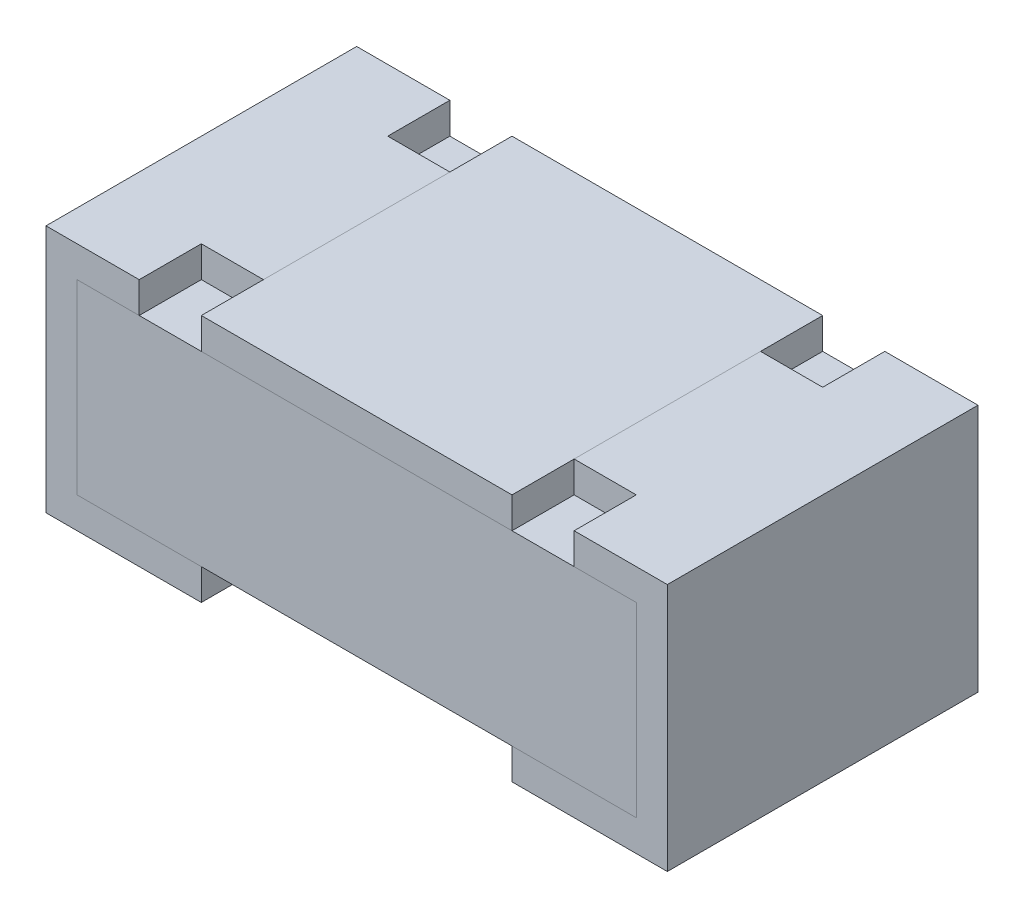
ISO-10303-21;
HEADER;
FILE_DESCRIPTION(('STEP AP214'),'2;1');
FILE_NAME('part.step','',(''),(''),'','','');
FILE_SCHEMA(('AUTOMOTIVE_DESIGN { 1 0 10303 214 1 1 1 1 }'));
ENDSEC;
DATA;
#1=APPLICATION_CONTEXT('core data for automotive mechanical design processes');
#2=APPLICATION_PROTOCOL_DEFINITION('international standard','automotive_design',2000,#1);
#3=PRODUCT_CONTEXT('',#1,'mechanical');
#4=PRODUCT('Part','Part','',(#3));
#5=PRODUCT_RELATED_PRODUCT_CATEGORY('part','',(#4));
#6=PRODUCT_DEFINITION_FORMATION('','',#4);
#7=PRODUCT_DEFINITION_CONTEXT('part definition',#1,'design');
#8=PRODUCT_DEFINITION('design','',#6,#7);
#9=PRODUCT_DEFINITION_SHAPE('','',#8);
#10=(LENGTH_UNIT() NAMED_UNIT(*) SI_UNIT(.MILLI.,.METRE.));
#11=(NAMED_UNIT(*) PLANE_ANGLE_UNIT() SI_UNIT($,.RADIAN.));
#12=(NAMED_UNIT(*) SI_UNIT($,.STERADIAN.) SOLID_ANGLE_UNIT());
#13=UNCERTAINTY_MEASURE_WITH_UNIT(LENGTH_MEASURE(1.E-05),#10,'distance_accuracy_value','');
#14=(GEOMETRIC_REPRESENTATION_CONTEXT(3) GLOBAL_UNCERTAINTY_ASSIGNED_CONTEXT((#13)) GLOBAL_UNIT_ASSIGNED_CONTEXT((#10,
#11,#12)) REPRESENTATION_CONTEXT('',''));
#15=CARTESIAN_POINT('',(0.,0.,0.));
#16=DIRECTION('',(0.,0.,1.));
#17=DIRECTION('',(1.,0.,0.));
#18=AXIS2_PLACEMENT_3D('',#15,#16,#17);
#19=CARTESIAN_POINT('',(-0.45,0.05,-0.25));
#20=DIRECTION('',(0.,1.,0.));
#21=DIRECTION('',(0.,0.,1.));
#22=AXIS2_PLACEMENT_3D('',#19,#20,#21);
#23=PLANE('',#22);
#24=DIRECTION('',(0.,0.,-1.));
#25=VECTOR('',#24,1.);
#26=CARTESIAN_POINT('',(-0.45,0.05,-0.25));
#27=LINE('',#26,#25);
#28=CARTESIAN_POINT('',(-0.45,0.05,0.25));
#29=VERTEX_POINT('',#28);
#30=CARTESIAN_POINT('',(-0.45,0.05,-0.25));
#31=VERTEX_POINT('',#30);
#32=EDGE_CURVE('P0_E58',#29,#31,#27,.T.);
#33=ORIENTED_EDGE('',*,*,#32,.T.);
#34=DIRECTION('',(1.,0.,0.));
#35=VECTOR('',#34,1.);
#36=CARTESIAN_POINT('',(0.45,0.05,-0.25));
#37=LINE('',#36,#35);
#38=CARTESIAN_POINT('',(0.45,0.05,-0.25));
#39=VERTEX_POINT('',#38);
#40=EDGE_CURVE('P0_E20',#31,#39,#37,.T.);
#41=ORIENTED_EDGE('',*,*,#40,.T.);
#42=DIRECTION('',(0.,0.,1.));
#43=VECTOR('',#42,1.);
#44=CARTESIAN_POINT('',(0.45,0.05,-0.25));
#45=LINE('',#44,#43);
#46=CARTESIAN_POINT('',(0.45,0.05,0.25));
#47=VERTEX_POINT('',#46);
#48=EDGE_CURVE('P0_E55',#39,#47,#45,.T.);
#49=ORIENTED_EDGE('',*,*,#48,.T.);
#50=DIRECTION('',(-1.,0.,0.));
#51=VECTOR('',#50,1.);
#52=CARTESIAN_POINT('',(0.45,0.05,0.25));
#53=LINE('',#52,#51);
#54=EDGE_CURVE('P0_E76',#47,#29,#53,.T.);
#55=ORIENTED_EDGE('',*,*,#54,.T.);
#56=EDGE_LOOP('',(#33,#41,#49,#55));
#57=FACE_BOUND('',#56,.T.);
#58=ADVANCED_FACE('P0_F17',(#57),#23,.F.);
#59=CARTESIAN_POINT('',(0.45,0.35,-0.25));
#60=DIRECTION('',(0.,0.,1.));
#61=DIRECTION('',(1.,0.,0.));
#62=AXIS2_PLACEMENT_3D('',#59,#60,#61);
#63=PLANE('',#62);
#64=ORIENTED_EDGE('',*,*,#40,.F.);
#65=DIRECTION('',(0.,1.,0.));
#66=VECTOR('',#65,1.);
#67=CARTESIAN_POINT('',(-0.45,0.35,-0.25));
#68=LINE('',#67,#66);
#69=CARTESIAN_POINT('',(-0.45,0.35,-0.25));
#70=VERTEX_POINT('',#69);
#71=EDGE_CURVE('P0_E80',#31,#70,#68,.T.);
#72=ORIENTED_EDGE('',*,*,#71,.T.);
#73=DIRECTION('',(1.,0.,0.));
#74=VECTOR('',#73,1.);
#75=CARTESIAN_POINT('',(-0.45,0.35,-0.25));
#76=LINE('',#75,#74);
#77=CARTESIAN_POINT('',(0.45,0.35,-0.25));
#78=VERTEX_POINT('',#77);
#79=EDGE_CURVE('P0_E73',#70,#78,#76,.T.);
#80=ORIENTED_EDGE('',*,*,#79,.T.);
#81=DIRECTION('',(0.,1.,0.));
#82=VECTOR('',#81,1.);
#83=CARTESIAN_POINT('',(0.45,0.35,-0.25));
#84=LINE('',#83,#82);
#85=EDGE_CURVE('P0_E63',#78,#39,#84,.F.);
#86=ORIENTED_EDGE('',*,*,#85,.T.);
#87=EDGE_LOOP('',(#64,#72,#80,#86));
#88=FACE_BOUND('',#87,.T.);
#89=ADVANCED_FACE('P0_F72',(#88),#63,.F.);
#90=CARTESIAN_POINT('',(0.45,0.35,-0.25));
#91=DIRECTION('',(-1.,0.,0.));
#92=DIRECTION('',(0.,0.,1.));
#93=AXIS2_PLACEMENT_3D('',#90,#91,#92);
#94=PLANE('',#93);
#95=ORIENTED_EDGE('',*,*,#48,.F.);
#96=ORIENTED_EDGE('',*,*,#85,.F.);
#97=DIRECTION('',(0.,0.,-1.));
#98=VECTOR('',#97,1.);
#99=CARTESIAN_POINT('',(0.45,0.35,0.25));
#100=LINE('',#99,#98);
#101=CARTESIAN_POINT('',(0.45,0.35,0.25));
#102=VERTEX_POINT('',#101);
#103=EDGE_CURVE('P0_E83',#78,#102,#100,.F.);
#104=ORIENTED_EDGE('',*,*,#103,.T.);
#105=DIRECTION('',(0.,1.,0.));
#106=VECTOR('',#105,1.);
#107=CARTESIAN_POINT('',(0.45,0.35,0.25));
#108=LINE('',#107,#106);
#109=EDGE_CURVE('P0_E69',#102,#47,#108,.F.);
#110=ORIENTED_EDGE('',*,*,#109,.T.);
#111=EDGE_LOOP('',(#95,#96,#104,#110));
#112=FACE_BOUND('',#111,.T.);
#113=ADVANCED_FACE('P0_F66',(#112),#94,.F.);
#114=CARTESIAN_POINT('',(0.45,0.35,0.25));
#115=DIRECTION('',(0.,0.,-1.));
#116=DIRECTION('',(-1.,0.,0.));
#117=AXIS2_PLACEMENT_3D('',#114,#115,#116);
#118=PLANE('',#117);
#119=ORIENTED_EDGE('',*,*,#54,.F.);
#120=ORIENTED_EDGE('',*,*,#109,.F.);
#121=DIRECTION('',(1.,0.,0.));
#122=VECTOR('',#121,1.);
#123=CARTESIAN_POINT('',(-0.45,0.35,0.25));
#124=LINE('',#123,#122);
#125=CARTESIAN_POINT('',(-0.45,0.35,0.25));
#126=VERTEX_POINT('',#125);
#127=EDGE_CURVE('P0_E26',#102,#126,#124,.F.);
#128=ORIENTED_EDGE('',*,*,#127,.T.);
#129=DIRECTION('',(0.,1.,0.));
#130=VECTOR('',#129,1.);
#131=CARTESIAN_POINT('',(-0.45,0.35,0.25));
#132=LINE('',#131,#130);
#133=EDGE_CURVE('P0_E34',#126,#29,#132,.F.);
#134=ORIENTED_EDGE('',*,*,#133,.T.);
#135=EDGE_LOOP('',(#119,#120,#128,#134));
#136=FACE_BOUND('',#135,.T.);
#137=ADVANCED_FACE('P0_F88',(#136),#118,.F.);
#138=CARTESIAN_POINT('',(-0.45,0.35,-0.25));
#139=DIRECTION('',(1.,0.,0.));
#140=DIRECTION('',(0.,0.,-1.));
#141=AXIS2_PLACEMENT_3D('',#138,#139,#140);
#142=PLANE('',#141);
#143=ORIENTED_EDGE('',*,*,#32,.F.);
#144=ORIENTED_EDGE('',*,*,#133,.F.);
#145=DIRECTION('',(0.,0.,-1.));
#146=VECTOR('',#145,1.);
#147=CARTESIAN_POINT('',(-0.45,0.35,0.25));
#148=LINE('',#147,#146);
#149=EDGE_CURVE('P0_E11',#126,#70,#148,.T.);
#150=ORIENTED_EDGE('',*,*,#149,.T.);
#151=ORIENTED_EDGE('',*,*,#71,.F.);
#152=EDGE_LOOP('',(#143,#144,#150,#151));
#153=FACE_BOUND('',#152,.T.);
#154=ADVANCED_FACE('P0_F91',(#153),#142,.F.);
#155=CARTESIAN_POINT('',(-0.45,0.35,0.25));
#156=DIRECTION('',(0.,-1.,0.));
#157=DIRECTION('',(0.,0.,-1.));
#158=AXIS2_PLACEMENT_3D('',#155,#156,#157);
#159=PLANE('',#158);
#160=ORIENTED_EDGE('',*,*,#127,.F.);
#161=ORIENTED_EDGE('',*,*,#103,.F.);
#162=ORIENTED_EDGE('',*,*,#79,.F.);
#163=ORIENTED_EDGE('',*,*,#149,.F.);
#164=EDGE_LOOP('',(#160,#161,#162,#163));
#165=FACE_BOUND('',#164,.T.);
#166=ADVANCED_FACE('P0_F90',(#165),#159,.F.);
#167=CLOSED_SHELL('',(#58,#89,#113,#137,#154,#166));
#168=MANIFOLD_SOLID_BREP('P0_B1',#167);
#169=CARTESIAN_POINT('',(0.752493781056,0.4,0.25));
#170=DIRECTION('',(0.,-1.,0.));
#171=DIRECTION('',(1.,0.,0.));
#172=AXIS2_PLACEMENT_3D('',#169,#170,#171);
#173=PLANE('',#172);
#174=DIRECTION('',(1.,0.,0.));
#175=VECTOR('',#174,1.);
#176=CARTESIAN_POINT('',(0.752493781056,0.4,-0.25));
#177=LINE('',#176,#175);
#178=CARTESIAN_POINT('',(0.25,0.4,-0.25));
#179=VERTEX_POINT('',#178);
#180=CARTESIAN_POINT('',(-0.25,0.4,-0.25));
#181=VERTEX_POINT('',#180);
#182=EDGE_CURVE('P1_E20',#179,#181,#177,.F.);
#183=ORIENTED_EDGE('',*,*,#182,.T.);
#184=DIRECTION('',(0.,0.,-1.));
#185=VECTOR('',#184,1.);
#186=CARTESIAN_POINT('',(-0.25,0.4,0.25));
#187=LINE('',#186,#185);
#188=CARTESIAN_POINT('',(-0.25,0.4,0.25));
#189=VERTEX_POINT('',#188);
#190=EDGE_CURVE('P1_E55',#181,#189,#187,.F.);
#191=ORIENTED_EDGE('',*,*,#190,.T.);
#192=DIRECTION('',(-1.,0.,0.));
#193=VECTOR('',#192,1.);
#194=CARTESIAN_POINT('',(0.752493781056,0.4,0.25));
#195=LINE('',#194,#193);
#196=CARTESIAN_POINT('',(0.25,0.4,0.25));
#197=VERTEX_POINT('',#196);
#198=EDGE_CURVE('P1_E76',#189,#197,#195,.F.);
#199=ORIENTED_EDGE('',*,*,#198,.T.);
#200=DIRECTION('',(0.,0.,1.));
#201=VECTOR('',#200,1.);
#202=CARTESIAN_POINT('',(0.25,0.4,0.25));
#203=LINE('',#202,#201);
#204=EDGE_CURVE('P1_E58',#179,#197,#203,.T.);
#205=ORIENTED_EDGE('',*,*,#204,.F.);
#206=EDGE_LOOP('',(#183,#191,#199,#205));
#207=FACE_BOUND('',#206,.T.);
#208=ADVANCED_FACE('P1_F17',(#207),#173,.F.);
#209=CARTESIAN_POINT('',(0.752493781056,0.4,-0.25));
#210=DIRECTION('',(0.,0.,1.));
#211=DIRECTION('',(1.,0.,0.));
#212=AXIS2_PLACEMENT_3D('',#209,#210,#211);
#213=PLANE('',#212);
#214=DIRECTION('',(-1.,0.,0.));
#215=VECTOR('',#214,1.);
#216=CARTESIAN_POINT('',(0.752493781056,0.35,-0.25));
#217=LINE('',#216,#215);
#218=CARTESIAN_POINT('',(0.25,0.35,-0.25));
#219=VERTEX_POINT('',#218);
#220=CARTESIAN_POINT('',(-0.25,0.35,-0.25));
#221=VERTEX_POINT('',#220);
#222=EDGE_CURVE('P1_E73',#219,#221,#217,.T.);
#223=ORIENTED_EDGE('',*,*,#222,.T.);
#224=DIRECTION('',(0.,1.,0.));
#225=VECTOR('',#224,1.);
#226=CARTESIAN_POINT('',(-0.25,0.35,-0.25));
#227=LINE('',#226,#225);
#228=EDGE_CURVE('P1_E63',#221,#181,#227,.T.);
#229=ORIENTED_EDGE('',*,*,#228,.T.);
#230=ORIENTED_EDGE('',*,*,#182,.F.);
#231=DIRECTION('',(0.,1.,0.));
#232=VECTOR('',#231,1.);
#233=CARTESIAN_POINT('',(0.25,0.4,-0.25));
#234=LINE('',#233,#232);
#235=EDGE_CURVE('P1_E80',#219,#179,#234,.T.);
#236=ORIENTED_EDGE('',*,*,#235,.F.);
#237=EDGE_LOOP('',(#223,#229,#230,#236));
#238=FACE_BOUND('',#237,.T.);
#239=ADVANCED_FACE('P1_F72',(#238),#213,.F.);
#240=CARTESIAN_POINT('',(-0.25,0.35,0.25));
#241=DIRECTION('',(1.,0.,0.));
#242=DIRECTION('',(0.,0.,-1.));
#243=AXIS2_PLACEMENT_3D('',#240,#241,#242);
#244=PLANE('',#243);
#245=ORIENTED_EDGE('',*,*,#190,.F.);
#246=ORIENTED_EDGE('',*,*,#228,.F.);
#247=DIRECTION('',(0.,0.,1.));
#248=VECTOR('',#247,1.);
#249=CARTESIAN_POINT('',(-0.25,0.35,0.25));
#250=LINE('',#249,#248);
#251=CARTESIAN_POINT('',(-0.25,0.35,0.25));
#252=VERTEX_POINT('',#251);
#253=EDGE_CURVE('P1_E83',#221,#252,#250,.T.);
#254=ORIENTED_EDGE('',*,*,#253,.T.);
#255=DIRECTION('',(0.,1.,0.));
#256=VECTOR('',#255,1.);
#257=CARTESIAN_POINT('',(-0.25,0.4,0.25));
#258=LINE('',#257,#256);
#259=EDGE_CURVE('P1_E69',#252,#189,#258,.T.);
#260=ORIENTED_EDGE('',*,*,#259,.T.);
#261=EDGE_LOOP('',(#245,#246,#254,#260));
#262=FACE_BOUND('',#261,.T.);
#263=ADVANCED_FACE('P1_F66',(#262),#244,.F.);
#264=CARTESIAN_POINT('',(0.752493781056,0.4,0.25));
#265=DIRECTION('',(0.,0.,-1.));
#266=DIRECTION('',(-1.,0.,0.));
#267=AXIS2_PLACEMENT_3D('',#264,#265,#266);
#268=PLANE('',#267);
#269=ORIENTED_EDGE('',*,*,#198,.F.);
#270=ORIENTED_EDGE('',*,*,#259,.F.);
#271=DIRECTION('',(-1.,0.,0.));
#272=VECTOR('',#271,1.);
#273=CARTESIAN_POINT('',(0.752493781056,0.35,0.25));
#274=LINE('',#273,#272);
#275=CARTESIAN_POINT('',(0.25,0.35,0.25));
#276=VERTEX_POINT('',#275);
#277=EDGE_CURVE('P1_E26',#252,#276,#274,.F.);
#278=ORIENTED_EDGE('',*,*,#277,.T.);
#279=DIRECTION('',(0.,1.,0.));
#280=VECTOR('',#279,1.);
#281=CARTESIAN_POINT('',(0.25,0.4,0.25));
#282=LINE('',#281,#280);
#283=EDGE_CURVE('P1_E34',#197,#276,#282,.F.);
#284=ORIENTED_EDGE('',*,*,#283,.F.);
#285=EDGE_LOOP('',(#269,#270,#278,#284));
#286=FACE_BOUND('',#285,.T.);
#287=ADVANCED_FACE('P1_F88',(#286),#268,.F.);
#288=CARTESIAN_POINT('',(0.25,0.4,0.25));
#289=DIRECTION('',(1.,0.,0.));
#290=DIRECTION('',(0.,1.,0.));
#291=AXIS2_PLACEMENT_3D('',#288,#289,#290);
#292=PLANE('',#291);
#293=DIRECTION('',(0.,0.,1.));
#294=VECTOR('',#293,1.);
#295=CARTESIAN_POINT('',(0.25,0.35,0.25));
#296=LINE('',#295,#294);
#297=EDGE_CURVE('P1_E11',#276,#219,#296,.F.);
#298=ORIENTED_EDGE('',*,*,#297,.T.);
#299=ORIENTED_EDGE('',*,*,#235,.T.);
#300=ORIENTED_EDGE('',*,*,#204,.T.);
#301=ORIENTED_EDGE('',*,*,#283,.T.);
#302=EDGE_LOOP('',(#298,#299,#300,#301));
#303=FACE_BOUND('',#302,.T.);
#304=ADVANCED_FACE('P1_F91',(#303),#292,.T.);
#305=CARTESIAN_POINT('',(0.752493781056,0.35,0.25));
#306=DIRECTION('',(0.,1.,0.));
#307=DIRECTION('',(-1.,0.,0.));
#308=AXIS2_PLACEMENT_3D('',#305,#306,#307);
#309=PLANE('',#308);
#310=ORIENTED_EDGE('',*,*,#277,.F.);
#311=ORIENTED_EDGE('',*,*,#253,.F.);
#312=ORIENTED_EDGE('',*,*,#222,.F.);
#313=ORIENTED_EDGE('',*,*,#297,.F.);
#314=EDGE_LOOP('',(#310,#311,#312,#313));
#315=FACE_BOUND('',#314,.T.);
#316=ADVANCED_FACE('P1_F90',(#315),#309,.F.);
#317=CLOSED_SHELL('',(#208,#239,#263,#287,#304,#316));
#318=MANIFOLD_SOLID_BREP('P1_B1',#317);
#319=CARTESIAN_POINT('',(0.25,-0.001000000000001,0.15));
#320=DIRECTION('',(0.,0.,-1.));
#321=DIRECTION('',(0.,1.,0.));
#322=AXIS2_PLACEMENT_3D('',#319,#320,#321);
#323=PLANE('',#322);
#324=DIRECTION('',(0.,1.,0.));
#325=VECTOR('',#324,1.);
#326=CARTESIAN_POINT('',(0.35,-0.001000000000001,0.15));
#327=LINE('',#326,#325);
#328=CARTESIAN_POINT('',(0.35,0.35,0.15));
#329=VERTEX_POINT('',#328);
#330=CARTESIAN_POINT('',(0.35,0.4,0.15));
#331=VERTEX_POINT('',#330);
#332=EDGE_CURVE('P2_E123',#329,#331,#327,.T.);
#333=ORIENTED_EDGE('',*,*,#332,.T.);
#334=DIRECTION('',(1.,0.,0.));
#335=VECTOR('',#334,1.);
#336=CARTESIAN_POINT('',(0.977493781056,0.4,0.15));
#337=LINE('',#336,#335);
#338=CARTESIAN_POINT('',(0.25,0.4,0.15));
#339=VERTEX_POINT('',#338);
#340=EDGE_CURVE('P2_E113',#331,#339,#337,.F.);
#341=ORIENTED_EDGE('',*,*,#340,.T.);
#342=DIRECTION('',(0.,1.,0.));
#343=VECTOR('',#342,1.);
#344=CARTESIAN_POINT('',(0.25,0.4,0.15));
#345=LINE('',#344,#343);
#346=CARTESIAN_POINT('',(0.25,0.35,0.15));
#347=VERTEX_POINT('',#346);
#348=EDGE_CURVE('P2_E20',#339,#347,#345,.F.);
#349=ORIENTED_EDGE('',*,*,#348,.T.);
#350=DIRECTION('',(-1.,0.,0.));
#351=VECTOR('',#350,1.);
#352=CARTESIAN_POINT('',(0.977493781056,0.35,0.15));
#353=LINE('',#352,#351);
#354=EDGE_CURVE('P2_E110',#347,#329,#353,.F.);
#355=ORIENTED_EDGE('',*,*,#354,.T.);
#356=EDGE_LOOP('',(#333,#341,#349,#355));
#357=FACE_BOUND('',#356,.T.);
#358=ADVANCED_FACE('P2_F17',(#357),#323,.F.);
#359=CARTESIAN_POINT('',(0.25,0.4,0.25));
#360=DIRECTION('',(1.,0.,0.));
#361=DIRECTION('',(0.,1.,0.));
#362=AXIS2_PLACEMENT_3D('',#359,#360,#361);
#363=PLANE('',#362);
#364=DIRECTION('',(0.,-1.,0.));
#365=VECTOR('',#364,1.);
#366=CARTESIAN_POINT('',(0.25,-0.001000000000001,-0.15));
#367=LINE('',#366,#365);
#368=CARTESIAN_POINT('',(0.25,0.4,-0.15));
#369=VERTEX_POINT('',#368);
#370=CARTESIAN_POINT('',(0.25,0.35,-0.15));
#371=VERTEX_POINT('',#370);
#372=EDGE_CURVE('P2_E116',#369,#371,#367,.T.);
#373=ORIENTED_EDGE('',*,*,#372,.T.);
#374=DIRECTION('',(0.,0.,1.));
#375=VECTOR('',#374,1.);
#376=CARTESIAN_POINT('',(0.25,0.35,-0.25));
#377=LINE('',#376,#375);
#378=EDGE_CURVE('P2_E118',#371,#347,#377,.T.);
#379=ORIENTED_EDGE('',*,*,#378,.T.);
#380=ORIENTED_EDGE('',*,*,#348,.F.);
#381=DIRECTION('',(0.,0.,1.));
#382=VECTOR('',#381,1.);
#383=CARTESIAN_POINT('',(0.25,0.4,0.25));
#384=LINE('',#383,#382);
#385=EDGE_CURVE('P2_E164',#339,#369,#384,.F.);
#386=ORIENTED_EDGE('',*,*,#385,.T.);
#387=EDGE_LOOP('',(#373,#379,#380,#386));
#388=FACE_BOUND('',#387,.T.);
#389=ADVANCED_FACE('P2_F119',(#388),#363,.F.);
#390=CARTESIAN_POINT('',(0.25,-0.001000000000001,-0.15));
#391=DIRECTION('',(0.,0.,1.));
#392=DIRECTION('',(0.,-1.,0.));
#393=AXIS2_PLACEMENT_3D('',#390,#391,#392);
#394=PLANE('',#393);
#395=ORIENTED_EDGE('',*,*,#372,.F.);
#396=DIRECTION('',(1.,0.,0.));
#397=VECTOR('',#396,1.);
#398=CARTESIAN_POINT('',(0.977493781056,0.4,-0.15));
#399=LINE('',#398,#397);
#400=CARTESIAN_POINT('',(0.35,0.4,-0.15));
#401=VERTEX_POINT('',#400);
#402=EDGE_CURVE('P2_E166',#369,#401,#399,.T.);
#403=ORIENTED_EDGE('',*,*,#402,.T.);
#404=DIRECTION('',(0.,1.,0.));
#405=VECTOR('',#404,1.);
#406=CARTESIAN_POINT('',(0.35,-0.001000000000001,-0.15));
#407=LINE('',#406,#405);
#408=CARTESIAN_POINT('',(0.35,0.35,-0.15));
#409=VERTEX_POINT('',#408);
#410=EDGE_CURVE('P2_E103',#401,#409,#407,.F.);
#411=ORIENTED_EDGE('',*,*,#410,.T.);
#412=DIRECTION('',(-1.,0.,0.));
#413=VECTOR('',#412,1.);
#414=CARTESIAN_POINT('',(0.977493781056,0.35,-0.15));
#415=LINE('',#414,#413);
#416=EDGE_CURVE('P2_E124',#409,#371,#415,.T.);
#417=ORIENTED_EDGE('',*,*,#416,.T.);
#418=EDGE_LOOP('',(#395,#403,#411,#417));
#419=FACE_BOUND('',#418,.T.);
#420=ADVANCED_FACE('P2_F248',(#419),#394,.F.);
#421=CARTESIAN_POINT('',(0.35,-0.001000000000001,-0.25));
#422=DIRECTION('',(1.,0.,0.));
#423=DIRECTION('',(0.,0.,-1.));
#424=AXIS2_PLACEMENT_3D('',#421,#422,#423);
#425=PLANE('',#424);
#426=ORIENTED_EDGE('',*,*,#410,.F.);
#427=DIRECTION('',(0.,0.,1.));
#428=VECTOR('',#427,1.);
#429=CARTESIAN_POINT('',(0.35,0.4,0.25));
#430=LINE('',#429,#428);
#431=CARTESIAN_POINT('',(0.35,0.4,-0.25));
#432=VERTEX_POINT('',#431);
#433=EDGE_CURVE('P2_E168',#401,#432,#430,.F.);
#434=ORIENTED_EDGE('',*,*,#433,.T.);
#435=DIRECTION('',(0.,1.,0.));
#436=VECTOR('',#435,1.);
#437=CARTESIAN_POINT('',(0.35,0.4,-0.25));
#438=LINE('',#437,#436);
#439=CARTESIAN_POINT('',(0.35,0.35,-0.25));
#440=VERTEX_POINT('',#439);
#441=EDGE_CURVE('P2_E153',#432,#440,#438,.F.);
#442=ORIENTED_EDGE('',*,*,#441,.T.);
#443=DIRECTION('',(0.,0.,1.));
#444=VECTOR('',#443,1.);
#445=CARTESIAN_POINT('',(0.35,0.35,-0.25));
#446=LINE('',#445,#444);
#447=EDGE_CURVE('P2_E133',#440,#409,#446,.T.);
#448=ORIENTED_EDGE('',*,*,#447,.T.);
#449=EDGE_LOOP('',(#426,#434,#442,#448));
#450=FACE_BOUND('',#449,.T.);
#451=ADVANCED_FACE('P2_F247',(#450),#425,.F.);
#452=CARTESIAN_POINT('',(0.45,0.05,-0.25));
#453=DIRECTION('',(0.,-1.,0.));
#454=DIRECTION('',(0.,0.,-1.));
#455=AXIS2_PLACEMENT_3D('',#452,#453,#454);
#456=PLANE('',#455);
#457=DIRECTION('',(-1.,0.,0.));
#458=VECTOR('',#457,1.);
#459=CARTESIAN_POINT('',(0.977493781056,0.05,0.25));
#460=LINE('',#459,#458);
#461=CARTESIAN_POINT('',(0.25,0.05,0.25));
#462=VERTEX_POINT('',#461);
#463=CARTESIAN_POINT('',(0.45,0.05,0.25));
#464=VERTEX_POINT('',#463);
#465=EDGE_CURVE('P2_E174',#462,#464,#460,.F.);
#466=ORIENTED_EDGE('',*,*,#465,.T.);
#467=DIRECTION('',(0.,0.,1.));
#468=VECTOR('',#467,1.);
#469=CARTESIAN_POINT('',(0.45,0.05,-0.25));
#470=LINE('',#469,#468);
#471=CARTESIAN_POINT('',(0.45,0.05,-0.25));
#472=VERTEX_POINT('',#471);
#473=EDGE_CURVE('P2_E131',#472,#464,#470,.T.);
#474=ORIENTED_EDGE('',*,*,#473,.F.);
#475=DIRECTION('',(1.,0.,0.));
#476=VECTOR('',#475,1.);
#477=CARTESIAN_POINT('',(0.977493781056,0.05,-0.25));
#478=LINE('',#477,#476);
#479=CARTESIAN_POINT('',(0.25,0.05,-0.25));
#480=VERTEX_POINT('',#479);
#481=EDGE_CURVE('P2_E149',#472,#480,#478,.F.);
#482=ORIENTED_EDGE('',*,*,#481,.T.);
#483=DIRECTION('',(0.,0.,1.));
#484=VECTOR('',#483,1.);
#485=CARTESIAN_POINT('',(0.25,0.05,0.));
#486=LINE('',#485,#484);
#487=EDGE_CURVE('P2_E143',#462,#480,#486,.F.);
#488=ORIENTED_EDGE('',*,*,#487,.F.);
#489=EDGE_LOOP('',(#466,#474,#482,#488));
#490=FACE_BOUND('',#489,.T.);
#491=ADVANCED_FACE('P2_F256',(#490),#456,.F.);
#492=CARTESIAN_POINT('',(0.45,0.35,-0.25));
#493=DIRECTION('',(-1.,0.,0.));
#494=DIRECTION('',(0.,-1.,0.));
#495=AXIS2_PLACEMENT_3D('',#492,#493,#494);
#496=PLANE('',#495);
#497=DIRECTION('',(0.,1.,0.));
#498=VECTOR('',#497,1.);
#499=CARTESIAN_POINT('',(0.45,0.4,-0.25));
#500=LINE('',#499,#498);
#501=CARTESIAN_POINT('',(0.45,0.35,-0.25));
#502=VERTEX_POINT('',#501);
#503=EDGE_CURVE('P2_E146',#502,#472,#500,.F.);
#504=ORIENTED_EDGE('',*,*,#503,.T.);
#505=ORIENTED_EDGE('',*,*,#473,.T.);
#506=DIRECTION('',(0.,1.,0.));
#507=VECTOR('',#506,1.);
#508=CARTESIAN_POINT('',(0.45,0.35,0.25));
#509=LINE('',#508,#507);
#510=CARTESIAN_POINT('',(0.45,0.35,0.25));
#511=VERTEX_POINT('',#510);
#512=EDGE_CURVE('P2_E176',#464,#511,#509,.T.);
#513=ORIENTED_EDGE('',*,*,#512,.T.);
#514=DIRECTION('',(0.,0.,1.));
#515=VECTOR('',#514,1.);
#516=CARTESIAN_POINT('',(0.45,0.35,-0.25));
#517=LINE('',#516,#515);
#518=EDGE_CURVE('P2_E130',#511,#502,#517,.F.);
#519=ORIENTED_EDGE('',*,*,#518,.T.);
#520=EDGE_LOOP('',(#504,#505,#513,#519));
#521=FACE_BOUND('',#520,.T.);
#522=ADVANCED_FACE('P2_F223',(#521),#496,.T.);
#523=CARTESIAN_POINT('',(0.977493781056,0.35,-0.25));
#524=DIRECTION('',(0.,1.,0.));
#525=DIRECTION('',(-1.,0.,0.));
#526=AXIS2_PLACEMENT_3D('',#523,#524,#525);
#527=PLANE('',#526);
#528=ORIENTED_EDGE('',*,*,#416,.F.);
#529=ORIENTED_EDGE('',*,*,#447,.F.);
#530=DIRECTION('',(1.,0.,0.));
#531=VECTOR('',#530,1.);
#532=CARTESIAN_POINT('',(0.977493781056,0.35,-0.25));
#533=LINE('',#532,#531);
#534=EDGE_CURVE('P2_E155',#440,#502,#533,.T.);
#535=ORIENTED_EDGE('',*,*,#534,.T.);
#536=ORIENTED_EDGE('',*,*,#518,.F.);
#537=DIRECTION('',(-1.,0.,0.));
#538=VECTOR('',#537,1.);
#539=CARTESIAN_POINT('',(0.977493781056,0.35,0.25));
#540=LINE('',#539,#538);
#541=CARTESIAN_POINT('',(0.35,0.35,0.25));
#542=VERTEX_POINT('',#541);
#543=EDGE_CURVE('P2_E178',#511,#542,#540,.T.);
#544=ORIENTED_EDGE('',*,*,#543,.T.);
#545=DIRECTION('',(0.,0.,-1.));
#546=VECTOR('',#545,1.);
#547=CARTESIAN_POINT('',(0.35,0.35,0.25));
#548=LINE('',#547,#546);
#549=EDGE_CURVE('P2_E128',#542,#329,#548,.T.);
#550=ORIENTED_EDGE('',*,*,#549,.T.);
#551=ORIENTED_EDGE('',*,*,#354,.F.);
#552=ORIENTED_EDGE('',*,*,#378,.F.);
#553=EDGE_LOOP('',(#528,#529,#535,#536,#544,#550,#551,#552));
#554=FACE_BOUND('',#553,.T.);
#555=ADVANCED_FACE('P2_F126',(#554),#527,.F.);
#556=CARTESIAN_POINT('',(0.35,-0.001000000000001,0.25));
#557=DIRECTION('',(1.,0.,0.));
#558=DIRECTION('',(0.,0.,-1.));
#559=AXIS2_PLACEMENT_3D('',#556,#557,#558);
#560=PLANE('',#559);
#561=DIRECTION('',(0.,1.,0.));
#562=VECTOR('',#561,1.);
#563=CARTESIAN_POINT('',(0.35,0.35,0.25));
#564=LINE('',#563,#562);
#565=CARTESIAN_POINT('',(0.35,0.4,0.25));
#566=VERTEX_POINT('',#565);
#567=EDGE_CURVE('P2_E180',#542,#566,#564,.T.);
#568=ORIENTED_EDGE('',*,*,#567,.T.);
#569=DIRECTION('',(0.,0.,1.));
#570=VECTOR('',#569,1.);
#571=CARTESIAN_POINT('',(0.35,0.4,0.25));
#572=LINE('',#571,#570);
#573=EDGE_CURVE('P2_E160',#566,#331,#572,.F.);
#574=ORIENTED_EDGE('',*,*,#573,.T.);
#575=ORIENTED_EDGE('',*,*,#332,.F.);
#576=ORIENTED_EDGE('',*,*,#549,.F.);
#577=EDGE_LOOP('',(#568,#574,#575,#576));
#578=FACE_BOUND('',#577,.T.);
#579=ADVANCED_FACE('P2_F211',(#578),#560,.F.);
#580=CARTESIAN_POINT('',(0.25,0.025,0.));
#581=DIRECTION('',(-1.,0.,0.));
#582=DIRECTION('',(0.,0.,1.));
#583=AXIS2_PLACEMENT_3D('',#580,#581,#582);
#584=PLANE('',#583);
#585=DIRECTION('',(0.,1.,0.));
#586=VECTOR('',#585,1.);
#587=CARTESIAN_POINT('',(0.25,0.4,-0.25));
#588=LINE('',#587,#586);
#589=CARTESIAN_POINT('',(0.25,0.,-0.25));
#590=VERTEX_POINT('',#589);
#591=EDGE_CURVE('P2_E151',#480,#590,#588,.F.);
#592=ORIENTED_EDGE('',*,*,#591,.T.);
#593=DIRECTION('',(0.,0.,1.));
#594=VECTOR('',#593,1.);
#595=CARTESIAN_POINT('',(0.25,0.,0.25));
#596=LINE('',#595,#594);
#597=CARTESIAN_POINT('',(0.25,0.,0.25));
#598=VERTEX_POINT('',#597);
#599=EDGE_CURVE('P2_E188',#590,#598,#596,.T.);
#600=ORIENTED_EDGE('',*,*,#599,.T.);
#601=DIRECTION('',(0.,1.,0.));
#602=VECTOR('',#601,1.);
#603=CARTESIAN_POINT('',(0.25,0.35,0.25));
#604=LINE('',#603,#602);
#605=EDGE_CURVE('P2_E171',#598,#462,#604,.T.);
#606=ORIENTED_EDGE('',*,*,#605,.T.);
#607=ORIENTED_EDGE('',*,*,#487,.T.);
#608=EDGE_LOOP('',(#592,#600,#606,#607));
#609=FACE_BOUND('',#608,.T.);
#610=ADVANCED_FACE('P2_F213',(#609),#584,.T.);
#611=CARTESIAN_POINT('',(0.977493781056,0.4,-0.25));
#612=DIRECTION('',(0.,0.,1.));
#613=DIRECTION('',(1.,0.,0.));
#614=AXIS2_PLACEMENT_3D('',#611,#612,#613);
#615=PLANE('',#614);
#616=ORIENTED_EDGE('',*,*,#441,.F.);
#617=DIRECTION('',(1.,0.,0.));
#618=VECTOR('',#617,1.);
#619=CARTESIAN_POINT('',(0.977493781056,0.4,-0.25));
#620=LINE('',#619,#618);
#621=CARTESIAN_POINT('',(0.5,0.4,-0.25));
#622=VERTEX_POINT('',#621);
#623=EDGE_CURVE('P2_E158',#432,#622,#620,.T.);
#624=ORIENTED_EDGE('',*,*,#623,.T.);
#625=DIRECTION('',(0.,1.,0.));
#626=VECTOR('',#625,1.);
#627=CARTESIAN_POINT('',(0.5,0.4,-0.25));
#628=LINE('',#627,#626);
#629=CARTESIAN_POINT('',(0.5,0.,-0.25));
#630=VERTEX_POINT('',#629);
#631=EDGE_CURVE('P2_E191',#630,#622,#628,.T.);
#632=ORIENTED_EDGE('',*,*,#631,.F.);
#633=DIRECTION('',(1.,0.,0.));
#634=VECTOR('',#633,1.);
#635=CARTESIAN_POINT('',(0.5,0.,-0.25));
#636=LINE('',#635,#634);
#637=EDGE_CURVE('P2_E185',#630,#590,#636,.F.);
#638=ORIENTED_EDGE('',*,*,#637,.T.);
#639=ORIENTED_EDGE('',*,*,#591,.F.);
#640=ORIENTED_EDGE('',*,*,#481,.F.);
#641=ORIENTED_EDGE('',*,*,#503,.F.);
#642=ORIENTED_EDGE('',*,*,#534,.F.);
#643=EDGE_LOOP('',(#616,#624,#632,#638,#639,#640,#641,#642));
#644=FACE_BOUND('',#643,.T.);
#645=ADVANCED_FACE('P2_F220',(#644),#615,.F.);
#646=CARTESIAN_POINT('',(0.977493781056,0.4,0.25));
#647=DIRECTION('',(0.,-1.,0.));
#648=DIRECTION('',(1.,0.,0.));
#649=AXIS2_PLACEMENT_3D('',#646,#647,#648);
#650=PLANE('',#649);
#651=ORIENTED_EDGE('',*,*,#402,.F.);
#652=ORIENTED_EDGE('',*,*,#385,.F.);
#653=ORIENTED_EDGE('',*,*,#340,.F.);
#654=ORIENTED_EDGE('',*,*,#573,.F.);
#655=DIRECTION('',(-1.,0.,0.));
#656=VECTOR('',#655,1.);
#657=CARTESIAN_POINT('',(0.977493781056,0.4,0.25));
#658=LINE('',#657,#656);
#659=CARTESIAN_POINT('',(0.5,0.4,0.25));
#660=VERTEX_POINT('',#659);
#661=EDGE_CURVE('P2_E182',#566,#660,#658,.F.);
#662=ORIENTED_EDGE('',*,*,#661,.T.);
#663=DIRECTION('',(0.,0.,1.));
#664=VECTOR('',#663,1.);
#665=CARTESIAN_POINT('',(0.5,0.4,0.25));
#666=LINE('',#665,#664);
#667=EDGE_CURVE('P2_E194',#622,#660,#666,.T.);
#668=ORIENTED_EDGE('',*,*,#667,.F.);
#669=ORIENTED_EDGE('',*,*,#623,.F.);
#670=ORIENTED_EDGE('',*,*,#433,.F.);
#671=EDGE_LOOP('',(#651,#652,#653,#654,#662,#668,#669,#670));
#672=FACE_BOUND('',#671,.T.);
#673=ADVANCED_FACE('P2_F208',(#672),#650,.F.);
#674=CARTESIAN_POINT('',(0.977493781056,0.35,0.25));
#675=DIRECTION('',(0.,0.,-1.));
#676=DIRECTION('',(-1.,0.,0.));
#677=AXIS2_PLACEMENT_3D('',#674,#675,#676);
#678=PLANE('',#677);
#679=ORIENTED_EDGE('',*,*,#567,.F.);
#680=ORIENTED_EDGE('',*,*,#543,.F.);
#681=ORIENTED_EDGE('',*,*,#512,.F.);
#682=ORIENTED_EDGE('',*,*,#465,.F.);
#683=ORIENTED_EDGE('',*,*,#605,.F.);
#684=DIRECTION('',(1.,0.,0.));
#685=VECTOR('',#684,1.);
#686=CARTESIAN_POINT('',(0.5,0.,0.25));
#687=LINE('',#686,#685);
#688=CARTESIAN_POINT('',(0.5,0.,0.25));
#689=VERTEX_POINT('',#688);
#690=EDGE_CURVE('P2_E35',#598,#689,#687,.T.);
#691=ORIENTED_EDGE('',*,*,#690,.T.);
#692=DIRECTION('',(0.,1.,0.));
#693=VECTOR('',#692,1.);
#694=CARTESIAN_POINT('',(0.5,0.4,0.25));
#695=LINE('',#694,#693);
#696=EDGE_CURVE('P2_E26',#660,#689,#695,.F.);
#697=ORIENTED_EDGE('',*,*,#696,.F.);
#698=ORIENTED_EDGE('',*,*,#661,.F.);
#699=EDGE_LOOP('',(#679,#680,#681,#682,#683,#691,#697,#698));
#700=FACE_BOUND('',#699,.T.);
#701=ADVANCED_FACE('P2_F203',(#700),#678,.F.);
#702=CARTESIAN_POINT('',(0.5,0.,0.25));
#703=DIRECTION('',(0.,1.,0.));
#704=DIRECTION('',(0.,0.,1.));
#705=AXIS2_PLACEMENT_3D('',#702,#703,#704);
#706=PLANE('',#705);
#707=ORIENTED_EDGE('',*,*,#637,.F.);
#708=DIRECTION('',(0.,0.,1.));
#709=VECTOR('',#708,1.);
#710=CARTESIAN_POINT('',(0.5,0.,0.25));
#711=LINE('',#710,#709);
#712=EDGE_CURVE('P2_E11',#689,#630,#711,.F.);
#713=ORIENTED_EDGE('',*,*,#712,.F.);
#714=ORIENTED_EDGE('',*,*,#690,.F.);
#715=ORIENTED_EDGE('',*,*,#599,.F.);
#716=EDGE_LOOP('',(#707,#713,#714,#715));
#717=FACE_BOUND('',#716,.T.);
#718=ADVANCED_FACE('P2_F226',(#717),#706,.F.);
#719=CARTESIAN_POINT('',(0.5,0.4,0.25));
#720=DIRECTION('',(1.,0.,0.));
#721=DIRECTION('',(0.,1.,0.));
#722=AXIS2_PLACEMENT_3D('',#719,#720,#721);
#723=PLANE('',#722);
#724=ORIENTED_EDGE('',*,*,#696,.T.);
#725=ORIENTED_EDGE('',*,*,#712,.T.);
#726=ORIENTED_EDGE('',*,*,#631,.T.);
#727=ORIENTED_EDGE('',*,*,#667,.T.);
#728=EDGE_LOOP('',(#724,#725,#726,#727));
#729=FACE_BOUND('',#728,.T.);
#730=ADVANCED_FACE('P2_F199',(#729),#723,.T.);
#731=CLOSED_SHELL('',(#358,#389,#420,#451,#491,#522,#555,#579,#610,#645,#673,#701,#718,#730));
#732=MANIFOLD_SOLID_BREP('P2_B1',#731);
#733=CARTESIAN_POINT('',(-0.45,0.35,-0.25));
#734=DIRECTION('',(1.,0.,0.));
#735=DIRECTION('',(0.,1.,0.));
#736=AXIS2_PLACEMENT_3D('',#733,#734,#735);
#737=PLANE('',#736);
#738=DIRECTION('',(0.,1.,0.));
#739=VECTOR('',#738,1.);
#740=CARTESIAN_POINT('',(-0.45,0.4,-0.25));
#741=LINE('',#740,#739);
#742=CARTESIAN_POINT('',(-0.45,0.05,-0.25));
#743=VERTEX_POINT('',#742);
#744=CARTESIAN_POINT('',(-0.45,0.35,-0.25));
#745=VERTEX_POINT('',#744);
#746=EDGE_CURVE('P3_E142',#743,#745,#741,.T.);
#747=ORIENTED_EDGE('',*,*,#746,.T.);
#748=DIRECTION('',(0.,0.,1.));
#749=VECTOR('',#748,1.);
#750=CARTESIAN_POINT('',(-0.45,0.35,-0.25));
#751=LINE('',#750,#749);
#752=CARTESIAN_POINT('',(-0.45,0.35,0.25));
#753=VERTEX_POINT('',#752);
#754=EDGE_CURVE('P3_E115',#745,#753,#751,.T.);
#755=ORIENTED_EDGE('',*,*,#754,.T.);
#756=DIRECTION('',(0.,1.,0.));
#757=VECTOR('',#756,1.);
#758=CARTESIAN_POINT('',(-0.45,0.35,0.25));
#759=LINE('',#758,#757);
#760=CARTESIAN_POINT('',(-0.45,0.05,0.25));
#761=VERTEX_POINT('',#760);
#762=EDGE_CURVE('P3_E144',#753,#761,#759,.F.);
#763=ORIENTED_EDGE('',*,*,#762,.T.);
#764=DIRECTION('',(0.,0.,-1.));
#765=VECTOR('',#764,1.);
#766=CARTESIAN_POINT('',(-0.45,0.05,-0.25));
#767=LINE('',#766,#765);
#768=EDGE_CURVE('P3_E20',#761,#743,#767,.T.);
#769=ORIENTED_EDGE('',*,*,#768,.T.);
#770=EDGE_LOOP('',(#747,#755,#763,#769));
#771=FACE_BOUND('',#770,.T.);
#772=ADVANCED_FACE('P3_F17',(#771),#737,.T.);
#773=CARTESIAN_POINT('',(-0.45,0.05,-0.25));
#774=DIRECTION('',(0.,-1.,0.));
#775=DIRECTION('',(0.,0.,-1.));
#776=AXIS2_PLACEMENT_3D('',#773,#774,#775);
#777=PLANE('',#776);
#778=DIRECTION('',(1.,0.,0.));
#779=VECTOR('',#778,1.);
#780=CARTESIAN_POINT('',(-0.977493781056,0.05,-0.25));
#781=LINE('',#780,#779);
#782=CARTESIAN_POINT('',(-0.25,0.05,-0.25));
#783=VERTEX_POINT('',#782);
#784=EDGE_CURVE('P3_E148',#783,#743,#781,.F.);
#785=ORIENTED_EDGE('',*,*,#784,.T.);
#786=ORIENTED_EDGE('',*,*,#768,.F.);
#787=DIRECTION('',(-1.,0.,0.));
#788=VECTOR('',#787,1.);
#789=CARTESIAN_POINT('',(-0.977493781056,0.05,0.25));
#790=LINE('',#789,#788);
#791=CARTESIAN_POINT('',(-0.25,0.05,0.25));
#792=VERTEX_POINT('',#791);
#793=EDGE_CURVE('P3_E192',#761,#792,#790,.F.);
#794=ORIENTED_EDGE('',*,*,#793,.T.);
#795=DIRECTION('',(0.,0.,-1.));
#796=VECTOR('',#795,1.);
#797=CARTESIAN_POINT('',(-0.25,0.05,0.));
#798=LINE('',#797,#796);
#799=EDGE_CURVE('P3_E133',#783,#792,#798,.F.);
#800=ORIENTED_EDGE('',*,*,#799,.F.);
#801=EDGE_LOOP('',(#785,#786,#794,#800));
#802=FACE_BOUND('',#801,.T.);
#803=ADVANCED_FACE('P3_F149',(#802),#777,.F.);
#804=CARTESIAN_POINT('',(-0.25,0.025,0.));
#805=DIRECTION('',(1.,0.,0.));
#806=DIRECTION('',(0.,0.,-1.));
#807=AXIS2_PLACEMENT_3D('',#804,#805,#806);
#808=PLANE('',#807);
#809=DIRECTION('',(0.,1.,0.));
#810=VECTOR('',#809,1.);
#811=CARTESIAN_POINT('',(-0.25,0.4,-0.25));
#812=LINE('',#811,#810);
#813=CARTESIAN_POINT('',(-0.25,0.,-0.25));
#814=VERTEX_POINT('',#813);
#815=EDGE_CURVE('P3_E151',#814,#783,#812,.T.);
#816=ORIENTED_EDGE('',*,*,#815,.T.);
#817=ORIENTED_EDGE('',*,*,#799,.T.);
#818=DIRECTION('',(0.,1.,0.));
#819=VECTOR('',#818,1.);
#820=CARTESIAN_POINT('',(-0.25,0.35,0.25));
#821=LINE('',#820,#819);
#822=CARTESIAN_POINT('',(-0.25,0.,0.25));
#823=VERTEX_POINT('',#822);
#824=EDGE_CURVE('P3_E195',#792,#823,#821,.F.);
#825=ORIENTED_EDGE('',*,*,#824,.T.);
#826=DIRECTION('',(0.,0.,1.));
#827=VECTOR('',#826,1.);
#828=CARTESIAN_POINT('',(-0.25,0.,0.25));
#829=LINE('',#828,#827);
#830=EDGE_CURVE('P3_E193',#823,#814,#829,.F.);
#831=ORIENTED_EDGE('',*,*,#830,.T.);
#832=EDGE_LOOP('',(#816,#817,#825,#831));
#833=FACE_BOUND('',#832,.T.);
#834=ADVANCED_FACE('P3_F219',(#833),#808,.T.);
#835=CARTESIAN_POINT('',(-0.977493781056,0.35,-0.25));
#836=DIRECTION('',(0.,1.,0.));
#837=DIRECTION('',(-1.,0.,0.));
#838=AXIS2_PLACEMENT_3D('',#835,#836,#837);
#839=PLANE('',#838);
#840=DIRECTION('',(1.,0.,0.));
#841=VECTOR('',#840,1.);
#842=CARTESIAN_POINT('',(-0.25,0.35,0.15));
#843=LINE('',#842,#841);
#844=CARTESIAN_POINT('',(-0.25,0.35,0.15));
#845=VERTEX_POINT('',#844);
#846=CARTESIAN_POINT('',(-0.35,0.35,0.15));
#847=VERTEX_POINT('',#846);
#848=EDGE_CURVE('P3_E165',#845,#847,#843,.F.);
#849=ORIENTED_EDGE('',*,*,#848,.T.);
#850=DIRECTION('',(0.,0.,1.));
#851=VECTOR('',#850,1.);
#852=CARTESIAN_POINT('',(-0.35,0.35,0.25));
#853=LINE('',#852,#851);
#854=CARTESIAN_POINT('',(-0.35,0.35,0.25));
#855=VERTEX_POINT('',#854);
#856=EDGE_CURVE('P3_E160',#847,#855,#853,.T.);
#857=ORIENTED_EDGE('',*,*,#856,.T.);
#858=DIRECTION('',(-1.,0.,0.));
#859=VECTOR('',#858,1.);
#860=CARTESIAN_POINT('',(-0.977493781056,0.35,0.25));
#861=LINE('',#860,#859);
#862=EDGE_CURVE('P3_E189',#855,#753,#861,.T.);
#863=ORIENTED_EDGE('',*,*,#862,.T.);
#864=ORIENTED_EDGE('',*,*,#754,.F.);
#865=DIRECTION('',(1.,0.,0.));
#866=VECTOR('',#865,1.);
#867=CARTESIAN_POINT('',(-0.977493781056,0.35,-0.25));
#868=LINE('',#867,#866);
#869=CARTESIAN_POINT('',(-0.35,0.35,-0.25));
#870=VERTEX_POINT('',#869);
#871=EDGE_CURVE('P3_E111',#745,#870,#868,.T.);
#872=ORIENTED_EDGE('',*,*,#871,.T.);
#873=DIRECTION('',(0.,0.,1.));
#874=VECTOR('',#873,1.);
#875=CARTESIAN_POINT('',(-0.35,0.35,-0.25));
#876=LINE('',#875,#874);
#877=CARTESIAN_POINT('',(-0.35,0.35,-0.15));
#878=VERTEX_POINT('',#877);
#879=EDGE_CURVE('P3_E106',#870,#878,#876,.T.);
#880=ORIENTED_EDGE('',*,*,#879,.T.);
#881=DIRECTION('',(1.,0.,0.));
#882=VECTOR('',#881,1.);
#883=CARTESIAN_POINT('',(-0.25,0.35,-0.15));
#884=LINE('',#883,#882);
#885=CARTESIAN_POINT('',(-0.25,0.35,-0.15));
#886=VERTEX_POINT('',#885);
#887=EDGE_CURVE('P3_E103',#878,#886,#884,.T.);
#888=ORIENTED_EDGE('',*,*,#887,.T.);
#889=DIRECTION('',(0.,0.,1.));
#890=VECTOR('',#889,1.);
#891=CARTESIAN_POINT('',(-0.25,0.35,0.25));
#892=LINE('',#891,#890);
#893=EDGE_CURVE('P3_E129',#886,#845,#892,.T.);
#894=ORIENTED_EDGE('',*,*,#893,.T.);
#895=EDGE_LOOP('',(#849,#857,#863,#864,#872,#880,#888,#894));
#896=FACE_BOUND('',#895,.T.);
#897=ADVANCED_FACE('P3_F108',(#896),#839,.F.);
#898=CARTESIAN_POINT('',(-0.35,-0.001000000000001,-0.25));
#899=DIRECTION('',(-1.,0.,0.));
#900=DIRECTION('',(0.,0.,1.));
#901=AXIS2_PLACEMENT_3D('',#898,#899,#900);
#902=PLANE('',#901);
#903=DIRECTION('',(0.,1.,0.));
#904=VECTOR('',#903,1.);
#905=CARTESIAN_POINT('',(-0.35,0.4,-0.25));
#906=LINE('',#905,#904);
#907=CARTESIAN_POINT('',(-0.35,0.4,-0.25));
#908=VERTEX_POINT('',#907);
#909=EDGE_CURVE('P3_E155',#870,#908,#906,.T.);
#910=ORIENTED_EDGE('',*,*,#909,.T.);
#911=DIRECTION('',(0.,0.,1.));
#912=VECTOR('',#911,1.);
#913=CARTESIAN_POINT('',(-0.35,0.4,0.25));
#914=LINE('',#913,#912);
#915=CARTESIAN_POINT('',(-0.35,0.4,-0.15));
#916=VERTEX_POINT('',#915);
#917=EDGE_CURVE('P3_E120',#908,#916,#914,.T.);
#918=ORIENTED_EDGE('',*,*,#917,.T.);
#919=DIRECTION('',(0.,-1.,0.));
#920=VECTOR('',#919,1.);
#921=CARTESIAN_POINT('',(-0.35,-0.001000000000001,-0.15));
#922=LINE('',#921,#920);
#923=EDGE_CURVE('P3_E114',#916,#878,#922,.T.);
#924=ORIENTED_EDGE('',*,*,#923,.T.);
#925=ORIENTED_EDGE('',*,*,#879,.F.);
#926=EDGE_LOOP('',(#910,#918,#924,#925));
#927=FACE_BOUND('',#926,.T.);
#928=ADVANCED_FACE('P3_F118',(#927),#902,.F.);
#929=CARTESIAN_POINT('',(-0.25,-0.001000000000001,-0.15));
#930=DIRECTION('',(0.,0.,1.));
#931=DIRECTION('',(0.,-1.,0.));
#932=AXIS2_PLACEMENT_3D('',#929,#930,#931);
#933=PLANE('',#932);
#934=ORIENTED_EDGE('',*,*,#923,.F.);
#935=DIRECTION('',(1.,0.,0.));
#936=VECTOR('',#935,1.);
#937=CARTESIAN_POINT('',(-0.977493781056,0.4,-0.15));
#938=LINE('',#937,#936);
#939=CARTESIAN_POINT('',(-0.25,0.4,-0.15));
#940=VERTEX_POINT('',#939);
#941=EDGE_CURVE('P3_E210',#916,#940,#938,.T.);
#942=ORIENTED_EDGE('',*,*,#941,.T.);
#943=DIRECTION('',(0.,-1.,0.));
#944=VECTOR('',#943,1.);
#945=CARTESIAN_POINT('',(-0.25,0.4,-0.15));
#946=LINE('',#945,#944);
#947=EDGE_CURVE('P3_E126',#940,#886,#946,.T.);
#948=ORIENTED_EDGE('',*,*,#947,.T.);
#949=ORIENTED_EDGE('',*,*,#887,.F.);
#950=EDGE_LOOP('',(#934,#942,#948,#949));
#951=FACE_BOUND('',#950,.T.);
#952=ADVANCED_FACE('P3_F124',(#951),#933,.F.);
#953=CARTESIAN_POINT('',(-0.25,0.4,0.25));
#954=DIRECTION('',(-1.,0.,0.));
#955=DIRECTION('',(0.,-1.,0.));
#956=AXIS2_PLACEMENT_3D('',#953,#954,#955);
#957=PLANE('',#956);
#958=DIRECTION('',(0.,1.,0.));
#959=VECTOR('',#958,1.);
#960=CARTESIAN_POINT('',(-0.25,-0.001000000000001,0.15));
#961=LINE('',#960,#959);
#962=CARTESIAN_POINT('',(-0.25,0.4,0.15));
#963=VERTEX_POINT('',#962);
#964=EDGE_CURVE('P3_E167',#963,#845,#961,.F.);
#965=ORIENTED_EDGE('',*,*,#964,.T.);
#966=ORIENTED_EDGE('',*,*,#893,.F.);
#967=ORIENTED_EDGE('',*,*,#947,.F.);
#968=DIRECTION('',(0.,0.,1.));
#969=VECTOR('',#968,1.);
#970=CARTESIAN_POINT('',(-0.25,0.4,0.25));
#971=LINE('',#970,#969);
#972=EDGE_CURVE('P3_E174',#940,#963,#971,.T.);
#973=ORIENTED_EDGE('',*,*,#972,.T.);
#974=EDGE_LOOP('',(#965,#966,#967,#973));
#975=FACE_BOUND('',#974,.T.);
#976=ADVANCED_FACE('P3_F172',(#975),#957,.F.);
#977=CARTESIAN_POINT('',(-0.25,-0.001000000000001,0.15));
#978=DIRECTION('',(0.,0.,-1.));
#979=DIRECTION('',(0.,1.,0.));
#980=AXIS2_PLACEMENT_3D('',#977,#978,#979);
#981=PLANE('',#980);
#982=ORIENTED_EDGE('',*,*,#964,.F.);
#983=DIRECTION('',(1.,0.,0.));
#984=VECTOR('',#983,1.);
#985=CARTESIAN_POINT('',(-0.977493781056,0.4,0.15));
#986=LINE('',#985,#984);
#987=CARTESIAN_POINT('',(-0.35,0.4,0.15));
#988=VERTEX_POINT('',#987);
#989=EDGE_CURVE('P3_E180',#963,#988,#986,.F.);
#990=ORIENTED_EDGE('',*,*,#989,.T.);
#991=DIRECTION('',(0.,1.,0.));
#992=VECTOR('',#991,1.);
#993=CARTESIAN_POINT('',(-0.35,-0.001000000000001,0.15));
#994=LINE('',#993,#992);
#995=EDGE_CURVE('P3_E162',#988,#847,#994,.F.);
#996=ORIENTED_EDGE('',*,*,#995,.T.);
#997=ORIENTED_EDGE('',*,*,#848,.F.);
#998=EDGE_LOOP('',(#982,#990,#996,#997));
#999=FACE_BOUND('',#998,.T.);
#1000=ADVANCED_FACE('P3_F177',(#999),#981,.F.);
#1001=CARTESIAN_POINT('',(-0.35,-0.001000000000001,0.25));
#1002=DIRECTION('',(-1.,0.,0.));
#1003=DIRECTION('',(0.,0.,1.));
#1004=AXIS2_PLACEMENT_3D('',#1001,#1002,#1003);
#1005=PLANE('',#1004);
#1006=ORIENTED_EDGE('',*,*,#995,.F.);
#1007=DIRECTION('',(0.,0.,1.));
#1008=VECTOR('',#1007,1.);
#1009=CARTESIAN_POINT('',(-0.35,0.4,0.25));
#1010=LINE('',#1009,#1008);
#1011=CARTESIAN_POINT('',(-0.35,0.4,0.25));
#1012=VERTEX_POINT('',#1011);
#1013=EDGE_CURVE('P3_E232',#988,#1012,#1010,.T.);
#1014=ORIENTED_EDGE('',*,*,#1013,.T.);
#1015=DIRECTION('',(0.,1.,0.));
#1016=VECTOR('',#1015,1.);
#1017=CARTESIAN_POINT('',(-0.35,0.35,0.25));
#1018=LINE('',#1017,#1016);
#1019=EDGE_CURVE('P3_E186',#1012,#855,#1018,.F.);
#1020=ORIENTED_EDGE('',*,*,#1019,.T.);
#1021=ORIENTED_EDGE('',*,*,#856,.F.);
#1022=EDGE_LOOP('',(#1006,#1014,#1020,#1021));
#1023=FACE_BOUND('',#1022,.T.);
#1024=ADVANCED_FACE('P3_F185',(#1023),#1005,.F.);
#1025=CARTESIAN_POINT('',(-0.977493781056,0.4,-0.25));
#1026=DIRECTION('',(0.,0.,1.));
#1027=DIRECTION('',(1.,0.,0.));
#1028=AXIS2_PLACEMENT_3D('',#1025,#1026,#1027);
#1029=PLANE('',#1028);
#1030=ORIENTED_EDGE('',*,*,#909,.F.);
#1031=ORIENTED_EDGE('',*,*,#871,.F.);
#1032=ORIENTED_EDGE('',*,*,#746,.F.);
#1033=ORIENTED_EDGE('',*,*,#784,.F.);
#1034=ORIENTED_EDGE('',*,*,#815,.F.);
#1035=DIRECTION('',(1.,0.,0.));
#1036=VECTOR('',#1035,1.);
#1037=CARTESIAN_POINT('',(-0.5,0.,-0.25));
#1038=LINE('',#1037,#1036);
#1039=CARTESIAN_POINT('',(-0.5,0.,-0.25));
#1040=VERTEX_POINT('',#1039);
#1041=EDGE_CURVE('P3_E198',#814,#1040,#1038,.F.);
#1042=ORIENTED_EDGE('',*,*,#1041,.T.);
#1043=DIRECTION('',(0.,-1.,0.));
#1044=VECTOR('',#1043,1.);
#1045=CARTESIAN_POINT('',(-0.5,0.4,-0.25));
#1046=LINE('',#1045,#1044);
#1047=CARTESIAN_POINT('',(-0.5,0.4,-0.25));
#1048=VERTEX_POINT('',#1047);
#1049=EDGE_CURVE('P3_E206',#1048,#1040,#1046,.T.);
#1050=ORIENTED_EDGE('',*,*,#1049,.F.);
#1051=DIRECTION('',(1.,0.,0.));
#1052=VECTOR('',#1051,1.);
#1053=CARTESIAN_POINT('',(-0.977493781056,0.4,-0.25));
#1054=LINE('',#1053,#1052);
#1055=EDGE_CURVE('P3_E204',#1048,#908,#1054,.T.);
#1056=ORIENTED_EDGE('',*,*,#1055,.T.);
#1057=EDGE_LOOP('',(#1030,#1031,#1032,#1033,#1034,#1042,#1050,#1056));
#1058=FACE_BOUND('',#1057,.T.);
#1059=ADVANCED_FACE('P3_F153',(#1058),#1029,.F.);
#1060=CARTESIAN_POINT('',(-0.5,0.,0.25));
#1061=DIRECTION('',(0.,1.,0.));
#1062=DIRECTION('',(0.,0.,1.));
#1063=AXIS2_PLACEMENT_3D('',#1060,#1061,#1062);
#1064=PLANE('',#1063);
#1065=DIRECTION('',(-1.,0.,0.));
#1066=VECTOR('',#1065,1.);
#1067=CARTESIAN_POINT('',(-0.977493781056,0.,0.25));
#1068=LINE('',#1067,#1066);
#1069=CARTESIAN_POINT('',(-0.5,0.,0.25));
#1070=VERTEX_POINT('',#1069);
#1071=EDGE_CURVE('P3_E217',#823,#1070,#1068,.T.);
#1072=ORIENTED_EDGE('',*,*,#1071,.T.);
#1073=DIRECTION('',(0.,0.,1.));
#1074=VECTOR('',#1073,1.);
#1075=CARTESIAN_POINT('',(-0.5,0.,0.25));
#1076=LINE('',#1075,#1074);
#1077=EDGE_CURVE('P3_E228',#1040,#1070,#1076,.T.);
#1078=ORIENTED_EDGE('',*,*,#1077,.F.);
#1079=ORIENTED_EDGE('',*,*,#1041,.F.);
#1080=ORIENTED_EDGE('',*,*,#830,.F.);
#1081=EDGE_LOOP('',(#1072,#1078,#1079,#1080));
#1082=FACE_BOUND('',#1081,.T.);
#1083=ADVANCED_FACE('P3_F223',(#1082),#1064,.F.);
#1084=CARTESIAN_POINT('',(-0.977493781056,0.35,0.25));
#1085=DIRECTION('',(0.,0.,-1.));
#1086=DIRECTION('',(-1.,0.,0.));
#1087=AXIS2_PLACEMENT_3D('',#1084,#1085,#1086);
#1088=PLANE('',#1087);
#1089=ORIENTED_EDGE('',*,*,#1019,.F.);
#1090=DIRECTION('',(1.,0.,0.));
#1091=VECTOR('',#1090,1.);
#1092=CARTESIAN_POINT('',(-0.977493781056,0.4,0.25));
#1093=LINE('',#1092,#1091);
#1094=CARTESIAN_POINT('',(-0.5,0.4,0.25));
#1095=VERTEX_POINT('',#1094);
#1096=EDGE_CURVE('P3_E35',#1012,#1095,#1093,.F.);
#1097=ORIENTED_EDGE('',*,*,#1096,.T.);
#1098=DIRECTION('',(0.,-1.,0.));
#1099=VECTOR('',#1098,1.);
#1100=CARTESIAN_POINT('',(-0.5,0.4,0.25));
#1101=LINE('',#1100,#1099);
#1102=EDGE_CURVE('P3_E26',#1070,#1095,#1101,.F.);
#1103=ORIENTED_EDGE('',*,*,#1102,.F.);
#1104=ORIENTED_EDGE('',*,*,#1071,.F.);
#1105=ORIENTED_EDGE('',*,*,#824,.F.);
#1106=ORIENTED_EDGE('',*,*,#793,.F.);
#1107=ORIENTED_EDGE('',*,*,#762,.F.);
#1108=ORIENTED_EDGE('',*,*,#862,.F.);
#1109=EDGE_LOOP('',(#1089,#1097,#1103,#1104,#1105,#1106,#1107,#1108));
#1110=FACE_BOUND('',#1109,.T.);
#1111=ADVANCED_FACE('P3_F191',(#1110),#1088,.F.);
#1112=CARTESIAN_POINT('',(-0.977493781056,0.4,0.25));
#1113=DIRECTION('',(0.,-1.,0.));
#1114=DIRECTION('',(1.,0.,0.));
#1115=AXIS2_PLACEMENT_3D('',#1112,#1113,#1114);
#1116=PLANE('',#1115);
#1117=ORIENTED_EDGE('',*,*,#989,.F.);
#1118=ORIENTED_EDGE('',*,*,#972,.F.);
#1119=ORIENTED_EDGE('',*,*,#941,.F.);
#1120=ORIENTED_EDGE('',*,*,#917,.F.);
#1121=ORIENTED_EDGE('',*,*,#1055,.F.);
#1122=DIRECTION('',(0.,0.,1.));
#1123=VECTOR('',#1122,1.);
#1124=CARTESIAN_POINT('',(-0.5,0.4,0.25));
#1125=LINE('',#1124,#1123);
#1126=EDGE_CURVE('P3_E11',#1095,#1048,#1125,.F.);
#1127=ORIENTED_EDGE('',*,*,#1126,.F.);
#1128=ORIENTED_EDGE('',*,*,#1096,.F.);
#1129=ORIENTED_EDGE('',*,*,#1013,.F.);
#1130=EDGE_LOOP('',(#1117,#1118,#1119,#1120,#1121,#1127,#1128,#1129));
#1131=FACE_BOUND('',#1130,.T.);
#1132=ADVANCED_FACE('P3_F209',(#1131),#1116,.F.);
#1133=CARTESIAN_POINT('',(-0.5,0.4,0.25));
#1134=DIRECTION('',(-1.,0.,0.));
#1135=DIRECTION('',(0.,-1.,0.));
#1136=AXIS2_PLACEMENT_3D('',#1133,#1134,#1135);
#1137=PLANE('',#1136);
#1138=ORIENTED_EDGE('',*,*,#1102,.T.);
#1139=ORIENTED_EDGE('',*,*,#1126,.T.);
#1140=ORIENTED_EDGE('',*,*,#1049,.T.);
#1141=ORIENTED_EDGE('',*,*,#1077,.T.);
#1142=EDGE_LOOP('',(#1138,#1139,#1140,#1141));
#1143=FACE_BOUND('',#1142,.T.);
#1144=ADVANCED_FACE('P3_F230',(#1143),#1137,.T.);
#1145=CLOSED_SHELL('',(#772,#803,#834,#897,#928,#952,#976,#1000,#1024,#1059,#1083,#1111,#1132,#1144));
#1146=MANIFOLD_SOLID_BREP('P3_B1',#1145);
#1147=ADVANCED_BREP_SHAPE_REPRESENTATION('',(#18,#168,#318,#732,#1146),#14);
#1148=SHAPE_DEFINITION_REPRESENTATION(#9,#1147);
ENDSEC;
END-ISO-10303-21;
